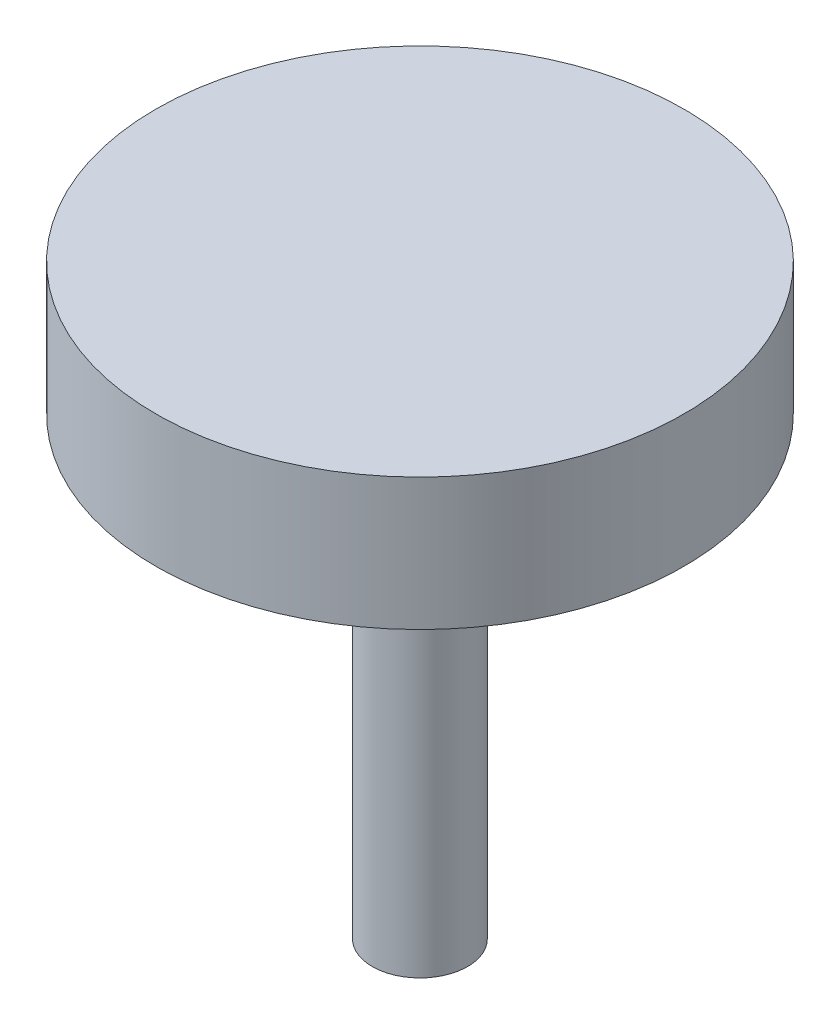
ISO-10303-21;
HEADER;
FILE_DESCRIPTION(('STEP AP214'),'2;1');
FILE_NAME('part.step','',(''),(''),'','','');
FILE_SCHEMA(('AUTOMOTIVE_DESIGN { 1 0 10303 214 1 1 1 1 }'));
ENDSEC;
DATA;
#1=APPLICATION_CONTEXT('core data for automotive mechanical design processes');
#2=APPLICATION_PROTOCOL_DEFINITION('international standard','automotive_design',2000,#1);
#3=PRODUCT_CONTEXT('',#1,'mechanical');
#4=PRODUCT('Part','Part','',(#3));
#5=PRODUCT_RELATED_PRODUCT_CATEGORY('part','',(#4));
#6=PRODUCT_DEFINITION_FORMATION('','',#4);
#7=PRODUCT_DEFINITION_CONTEXT('part definition',#1,'design');
#8=PRODUCT_DEFINITION('design','',#6,#7);
#9=PRODUCT_DEFINITION_SHAPE('','',#8);
#10=(LENGTH_UNIT() NAMED_UNIT(*) SI_UNIT(.MILLI.,.METRE.));
#11=(NAMED_UNIT(*) PLANE_ANGLE_UNIT() SI_UNIT($,.RADIAN.));
#12=(NAMED_UNIT(*) SI_UNIT($,.STERADIAN.) SOLID_ANGLE_UNIT());
#13=UNCERTAINTY_MEASURE_WITH_UNIT(LENGTH_MEASURE(1.E-05),#10,'distance_accuracy_value','');
#14=(GEOMETRIC_REPRESENTATION_CONTEXT(3) GLOBAL_UNCERTAINTY_ASSIGNED_CONTEXT((#13)) GLOBAL_UNIT_ASSIGNED_CONTEXT((#10,
#11,#12)) REPRESENTATION_CONTEXT('',''));
#15=CARTESIAN_POINT('',(0.,0.,0.));
#16=DIRECTION('',(0.,0.,1.));
#17=DIRECTION('',(1.,0.,0.));
#18=AXIS2_PLACEMENT_3D('',#15,#16,#17);
#19=CARTESIAN_POINT('',(0.,8.,0.));
#20=DIRECTION('',(0.,1.,0.));
#21=DIRECTION('',(-1.,0.,0.));
#22=AXIS2_PLACEMENT_3D('',#19,#20,#21);
#23=CYLINDRICAL_SURFACE('',#22,0.649999999999999);
#24=CARTESIAN_POINT('',(0.,0.,0.));
#25=DIRECTION('',(0.,1.,0.));
#26=DIRECTION('',(-1.,0.,0.));
#27=AXIS2_PLACEMENT_3D('',#24,#25,#26);
#28=CIRCLE('',#27,0.649999999999999);
#29=CARTESIAN_POINT('',(-0.649999999999999,0.,0.));
#30=VERTEX_POINT('',#29);
#31=EDGE_CURVE('E44',#30,#30,#28,.T.);
#32=ORIENTED_EDGE('',*,*,#31,.T.);
#33=EDGE_LOOP('',(#32));
#34=FACE_BOUND('',#33,.T.);
#35=CARTESIAN_POINT('',(0.,6.2,0.));
#36=DIRECTION('',(0.,1.,0.));
#37=DIRECTION('',(-1.,0.,0.));
#38=AXIS2_PLACEMENT_3D('',#35,#36,#37);
#39=CIRCLE('',#38,0.649999999999999);
#40=CARTESIAN_POINT('',(-0.650000000000002,6.2,0.));
#41=VERTEX_POINT('',#40);
#42=EDGE_CURVE('E10',#41,#41,#39,.T.);
#43=ORIENTED_EDGE('',*,*,#42,.F.);
#44=EDGE_LOOP('',(#43));
#45=FACE_BOUND('',#44,.T.);
#46=ADVANCED_FACE('F37',(#34,#45),#23,.T.);
#47=CARTESIAN_POINT('',(0.,0.,0.));
#48=DIRECTION('',(0.,1.,0.));
#49=DIRECTION('',(-1.,0.,0.));
#50=AXIS2_PLACEMENT_3D('',#47,#48,#49);
#51=PLANE('',#50);
#52=ORIENTED_EDGE('',*,*,#31,.F.);
#53=EDGE_LOOP('',(#52));
#54=FACE_BOUND('',#53,.T.);
#55=ADVANCED_FACE('F39',(#54),#51,.F.);
#56=CARTESIAN_POINT('',(0.,6.2,0.));
#57=DIRECTION('',(0.,1.,0.));
#58=DIRECTION('',(-1.,0.,0.));
#59=AXIS2_PLACEMENT_3D('',#56,#57,#58);
#60=PLANE('',#59);
#61=ORIENTED_EDGE('',*,*,#42,.T.);
#62=EDGE_LOOP('',(#61));
#63=FACE_BOUND('',#62,.T.);
#64=CARTESIAN_POINT('',(0.,6.19999999999999,0.));
#65=DIRECTION('',(0.,1.,0.));
#66=DIRECTION('',(-1.,0.,0.));
#67=AXIS2_PLACEMENT_3D('',#64,#65,#66);
#68=CIRCLE('',#67,3.6);
#69=CARTESIAN_POINT('',(-3.6,6.19999999999999,0.));
#70=VERTEX_POINT('',#69);
#71=EDGE_CURVE('E48',#70,#70,#68,.T.);
#72=ORIENTED_EDGE('',*,*,#71,.F.);
#73=EDGE_LOOP('',(#72));
#74=FACE_BOUND('',#73,.T.);
#75=ADVANCED_FACE('F63',(#63,#74),#60,.F.);
#76=CARTESIAN_POINT('',(0.,8.,0.));
#77=DIRECTION('',(0.,1.,0.));
#78=DIRECTION('',(-1.,0.,0.));
#79=AXIS2_PLACEMENT_3D('',#76,#77,#78);
#80=CYLINDRICAL_SURFACE('',#79,3.6);
#81=CARTESIAN_POINT('',(0.,7.99999999999999,0.));
#82=DIRECTION('',(0.,1.,0.));
#83=DIRECTION('',(-1.,0.,0.));
#84=AXIS2_PLACEMENT_3D('',#81,#82,#83);
#85=CIRCLE('',#84,3.6);
#86=CARTESIAN_POINT('',(-3.60000000000001,7.99999999999999,0.));
#87=VERTEX_POINT('',#86);
#88=EDGE_CURVE('E52',#87,#87,#85,.T.);
#89=ORIENTED_EDGE('',*,*,#88,.F.);
#90=EDGE_LOOP('',(#89));
#91=FACE_BOUND('',#90,.T.);
#92=ORIENTED_EDGE('',*,*,#71,.T.);
#93=EDGE_LOOP('',(#92));
#94=FACE_BOUND('',#93,.T.);
#95=ADVANCED_FACE('F60',(#91,#94),#80,.T.);
#96=CARTESIAN_POINT('',(0.649999999999996,8.,0.));
#97=DIRECTION('',(0.,-1.,0.));
#98=DIRECTION('',(1.,0.,0.));
#99=AXIS2_PLACEMENT_3D('',#96,#97,#98);
#100=PLANE('',#99);
#101=ORIENTED_EDGE('',*,*,#88,.T.);
#102=EDGE_LOOP('',(#101));
#103=FACE_BOUND('',#102,.T.);
#104=ADVANCED_FACE('F58',(#103),#100,.F.);
#105=CLOSED_SHELL('',(#46,#55,#75,#95,#104));
#106=MANIFOLD_SOLID_BREP('B2',#105);
#107=ADVANCED_BREP_SHAPE_REPRESENTATION('',(#18,#106),#14);
#108=SHAPE_DEFINITION_REPRESENTATION(#9,#107);
ENDSEC;
END-ISO-10303-21;
